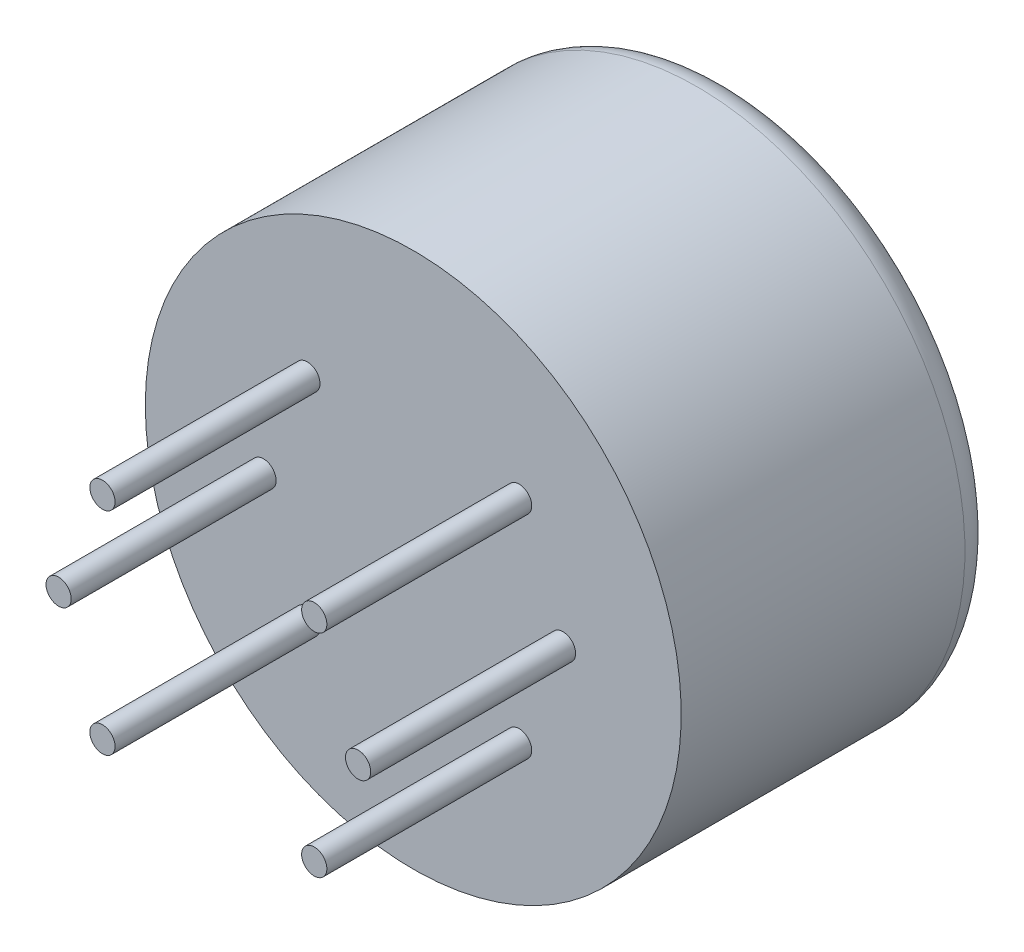
ISO-10303-21;
HEADER;
FILE_DESCRIPTION(('STEP AP214'),'2;1');
FILE_NAME('part.step','',(''),(''),'','','');
FILE_SCHEMA(('AUTOMOTIVE_DESIGN { 1 0 10303 214 1 1 1 1 }'));
ENDSEC;
DATA;
#1=APPLICATION_CONTEXT('core data for automotive mechanical design processes');
#2=APPLICATION_PROTOCOL_DEFINITION('international standard','automotive_design',2000,#1);
#3=PRODUCT_CONTEXT('',#1,'mechanical');
#4=PRODUCT('Part','Part','',(#3));
#5=PRODUCT_RELATED_PRODUCT_CATEGORY('part','',(#4));
#6=PRODUCT_DEFINITION_FORMATION('','',#4);
#7=PRODUCT_DEFINITION_CONTEXT('part definition',#1,'design');
#8=PRODUCT_DEFINITION('design','',#6,#7);
#9=PRODUCT_DEFINITION_SHAPE('','',#8);
#10=(LENGTH_UNIT() NAMED_UNIT(*) SI_UNIT(.MILLI.,.METRE.));
#11=(NAMED_UNIT(*) PLANE_ANGLE_UNIT() SI_UNIT($,.RADIAN.));
#12=(NAMED_UNIT(*) SI_UNIT($,.STERADIAN.) SOLID_ANGLE_UNIT());
#13=UNCERTAINTY_MEASURE_WITH_UNIT(LENGTH_MEASURE(1.E-05),#10,'distance_accuracy_value','');
#14=(GEOMETRIC_REPRESENTATION_CONTEXT(3) GLOBAL_UNCERTAINTY_ASSIGNED_CONTEXT((#13)) GLOBAL_UNIT_ASSIGNED_CONTEXT((#10,
#11,#12)) REPRESENTATION_CONTEXT('',''));
#15=CARTESIAN_POINT('',(0.,0.,0.));
#16=DIRECTION('',(0.,0.,1.));
#17=DIRECTION('',(1.,0.,0.));
#18=AXIS2_PLACEMENT_3D('',#15,#16,#17);
#19=CARTESIAN_POINT('',(0.,0.,-8.));
#20=DIRECTION('',(0.,0.,1.));
#21=DIRECTION('',(1.,0.,0.));
#22=AXIS2_PLACEMENT_3D('',#19,#20,#21);
#23=PLANE('',#22);
#24=CARTESIAN_POINT('',(0.,0.,-8.));
#25=DIRECTION('',(0.,0.,-1.));
#26=DIRECTION('',(-1.,0.,0.));
#27=AXIS2_PLACEMENT_3D('',#24,#25,#26);
#28=CIRCLE('',#27,3.95);
#29=CARTESIAN_POINT('',(-3.95,0.,-8.));
#30=VERTEX_POINT('',#29);
#31=EDGE_CURVE('E98',#30,#30,#28,.T.);
#32=ORIENTED_EDGE('',*,*,#31,.T.);
#33=EDGE_LOOP('',(#32));
#34=FACE_BOUND('',#33,.T.);
#35=ADVANCED_FACE('F43',(#34),#23,.F.);
#36=CARTESIAN_POINT('',(0.,0.,0.));
#37=DIRECTION('',(0.,0.,-1.));
#38=DIRECTION('',(-1.,0.,0.));
#39=AXIS2_PLACEMENT_3D('',#36,#37,#38);
#40=PLANE('',#39);
#41=CARTESIAN_POINT('',(-3.35875721063614,-3.35875721063606,0.));
#42=DIRECTION('',(0.,0.,-1.));
#43=DIRECTION('',(-1.,0.,0.));
#44=AXIS2_PLACEMENT_3D('',#41,#42,#43);
#45=CIRCLE('',#44,0.400000000000001);
#46=CARTESIAN_POINT('',(-3.75875721063614,-3.35875721063606,0.));
#47=VERTEX_POINT('',#46);
#48=EDGE_CURVE('E10',#47,#47,#45,.F.);
#49=ORIENTED_EDGE('',*,*,#48,.F.);
#50=EDGE_LOOP('',(#49));
#51=FACE_BOUND('',#50,.T.);
#52=CARTESIAN_POINT('',(3.35875721063607,-3.35875721063613,0.));
#53=DIRECTION('',(0.,0.,-1.));
#54=DIRECTION('',(-1.,0.,0.));
#55=AXIS2_PLACEMENT_3D('',#52,#53,#54);
#56=CIRCLE('',#55,0.4);
#57=CARTESIAN_POINT('',(2.95875721063607,-3.35875721063613,0.));
#58=VERTEX_POINT('',#57);
#59=EDGE_CURVE('E50',#58,#58,#56,.F.);
#60=ORIENTED_EDGE('',*,*,#59,.F.);
#61=EDGE_LOOP('',(#60));
#62=FACE_BOUND('',#61,.T.);
#63=CARTESIAN_POINT('',(4.75,0.,0.));
#64=DIRECTION('',(0.,0.,-1.));
#65=DIRECTION('',(-1.,0.,0.));
#66=AXIS2_PLACEMENT_3D('',#63,#64,#65);
#67=CIRCLE('',#66,0.4);
#68=CARTESIAN_POINT('',(4.35,0.,0.));
#69=VERTEX_POINT('',#68);
#70=EDGE_CURVE('E55',#69,#69,#67,.F.);
#71=ORIENTED_EDGE('',*,*,#70,.F.);
#72=EDGE_LOOP('',(#71));
#73=FACE_BOUND('',#72,.T.);
#74=CARTESIAN_POINT('',(3.35875721063612,3.35875721063608,0.));
#75=DIRECTION('',(0.,0.,-1.));
#76=DIRECTION('',(-1.,0.,0.));
#77=AXIS2_PLACEMENT_3D('',#74,#75,#76);
#78=CIRCLE('',#77,0.4);
#79=CARTESIAN_POINT('',(2.95875721063612,3.35875721063608,0.));
#80=VERTEX_POINT('',#79);
#81=EDGE_CURVE('E60',#80,#80,#78,.F.);
#82=ORIENTED_EDGE('',*,*,#81,.F.);
#83=EDGE_LOOP('',(#82));
#84=FACE_BOUND('',#83,.T.);
#85=CARTESIAN_POINT('',(-3.35875721063609,3.35875721063611,0.));
#86=DIRECTION('',(0.,0.,-1.));
#87=DIRECTION('',(-1.,0.,0.));
#88=AXIS2_PLACEMENT_3D('',#85,#86,#87);
#89=CIRCLE('',#88,0.4);
#90=CARTESIAN_POINT('',(-3.75875721063609,3.35875721063611,0.));
#91=VERTEX_POINT('',#90);
#92=EDGE_CURVE('E66',#91,#91,#89,.F.);
#93=ORIENTED_EDGE('',*,*,#92,.F.);
#94=EDGE_LOOP('',(#93));
#95=FACE_BOUND('',#94,.T.);
#96=CARTESIAN_POINT('',(-4.75,0.,0.));
#97=DIRECTION('',(0.,0.,-1.));
#98=DIRECTION('',(-1.,0.,0.));
#99=AXIS2_PLACEMENT_3D('',#96,#97,#98);
#100=CIRCLE('',#99,0.4);
#101=CARTESIAN_POINT('',(-5.15,0.,0.));
#102=VERTEX_POINT('',#101);
#103=EDGE_CURVE('E70',#102,#102,#100,.F.);
#104=ORIENTED_EDGE('',*,*,#103,.F.);
#105=EDGE_LOOP('',(#104));
#106=FACE_BOUND('',#105,.T.);
#107=CARTESIAN_POINT('',(0.,0.,0.));
#108=DIRECTION('',(0.,0.,-1.));
#109=DIRECTION('',(-1.,0.,0.));
#110=AXIS2_PLACEMENT_3D('',#107,#108,#109);
#111=CIRCLE('',#110,8.5);
#112=CARTESIAN_POINT('',(-8.5,0.,0.));
#113=VERTEX_POINT('',#112);
#114=EDGE_CURVE('E74',#113,#113,#111,.T.);
#115=ORIENTED_EDGE('',*,*,#114,.F.);
#116=EDGE_LOOP('',(#115));
#117=FACE_BOUND('',#116,.T.);
#118=ADVANCED_FACE('F142',(#51,#62,#73,#84,#95,#106,#117),#40,.F.);
#119=CARTESIAN_POINT('',(0.,0.,-9.83171526777697));
#120=DIRECTION('',(0.,0.,-1.));
#121=DIRECTION('',(-1.,0.,0.));
#122=AXIS2_PLACEMENT_3D('',#119,#120,#121);
#123=CYLINDRICAL_SURFACE('',#122,8.5);
#124=CARTESIAN_POINT('',(0.,0.,-8.99999999999999));
#125=DIRECTION('',(0.,0.,-1.));
#126=DIRECTION('',(-1.,0.,0.));
#127=AXIS2_PLACEMENT_3D('',#124,#125,#126);
#128=CIRCLE('',#127,8.5);
#129=CARTESIAN_POINT('',(-8.5,0.,-8.99999999999999));
#130=VERTEX_POINT('',#129);
#131=EDGE_CURVE('E78',#130,#130,#128,.T.);
#132=ORIENTED_EDGE('',*,*,#131,.F.);
#133=EDGE_LOOP('',(#132));
#134=FACE_BOUND('',#133,.T.);
#135=ORIENTED_EDGE('',*,*,#114,.T.);
#136=EDGE_LOOP('',(#135));
#137=FACE_BOUND('',#136,.T.);
#138=ADVANCED_FACE('F147',(#134,#137),#123,.T.);
#139=CARTESIAN_POINT('',(0.,0.,-9.));
#140=DIRECTION('',(0.,0.,-1.));
#141=DIRECTION('',(-1.,0.,0.));
#142=AXIS2_PLACEMENT_3D('',#139,#140,#141);
#143=TOROIDAL_SURFACE('',#142,7.5,1.);
#144=CARTESIAN_POINT('',(0.,0.,-10.));
#145=DIRECTION('',(0.,0.,-1.));
#146=DIRECTION('',(-1.,0.,0.));
#147=AXIS2_PLACEMENT_3D('',#144,#145,#146);
#148=CIRCLE('',#147,7.5);
#149=CARTESIAN_POINT('',(-7.5,0.,-10.));
#150=VERTEX_POINT('',#149);
#151=EDGE_CURVE('E82',#150,#150,#148,.T.);
#152=ORIENTED_EDGE('',*,*,#151,.F.);
#153=EDGE_LOOP('',(#152));
#154=FACE_BOUND('',#153,.T.);
#155=ORIENTED_EDGE('',*,*,#131,.T.);
#156=EDGE_LOOP('',(#155));
#157=FACE_BOUND('',#156,.T.);
#158=ADVANCED_FACE('F173',(#154,#157),#143,.T.);
#159=CARTESIAN_POINT('',(0.,0.,-10.));
#160=DIRECTION('',(0.,0.,1.));
#161=DIRECTION('',(1.,0.,0.));
#162=AXIS2_PLACEMENT_3D('',#159,#160,#161);
#163=PLANE('',#162);
#164=CARTESIAN_POINT('',(0.,0.,-10.));
#165=DIRECTION('',(0.,0.,-1.));
#166=DIRECTION('',(-1.,0.,0.));
#167=AXIS2_PLACEMENT_3D('',#164,#165,#166);
#168=CIRCLE('',#167,4.55);
#169=CARTESIAN_POINT('',(-4.55,0.,-10.));
#170=VERTEX_POINT('',#169);
#171=EDGE_CURVE('E86',#170,#170,#168,.T.);
#172=ORIENTED_EDGE('',*,*,#171,.F.);
#173=EDGE_LOOP('',(#172));
#174=FACE_BOUND('',#173,.T.);
#175=ORIENTED_EDGE('',*,*,#151,.T.);
#176=EDGE_LOOP('',(#175));
#177=FACE_BOUND('',#176,.T.);
#178=ADVANCED_FACE('F167',(#174,#177),#163,.F.);
#179=CARTESIAN_POINT('',(0.,0.,-9.7));
#180=DIRECTION('',(0.,0.,-1.));
#181=DIRECTION('',(-1.,0.,0.));
#182=AXIS2_PLACEMENT_3D('',#179,#180,#181);
#183=TOROIDAL_SURFACE('',#182,4.55,0.3);
#184=CARTESIAN_POINT('',(0.,0.,-9.7));
#185=DIRECTION('',(0.,0.,-1.));
#186=DIRECTION('',(-1.,0.,0.));
#187=AXIS2_PLACEMENT_3D('',#184,#185,#186);
#188=CIRCLE('',#187,4.25);
#189=CARTESIAN_POINT('',(-4.25,0.,-9.7));
#190=VERTEX_POINT('',#189);
#191=EDGE_CURVE('E90',#190,#190,#188,.T.);
#192=ORIENTED_EDGE('',*,*,#191,.F.);
#193=EDGE_LOOP('',(#192));
#194=FACE_BOUND('',#193,.T.);
#195=ORIENTED_EDGE('',*,*,#171,.T.);
#196=EDGE_LOOP('',(#195));
#197=FACE_BOUND('',#196,.T.);
#198=ADVANCED_FACE('F161',(#194,#197),#183,.T.);
#199=CARTESIAN_POINT('',(0.,0.,-9.83171526777697));
#200=DIRECTION('',(0.,0.,-1.));
#201=DIRECTION('',(-1.,0.,0.));
#202=AXIS2_PLACEMENT_3D('',#199,#200,#201);
#203=CYLINDRICAL_SURFACE('',#202,4.25);
#204=CARTESIAN_POINT('',(0.,0.,-8.3));
#205=DIRECTION('',(0.,0.,-1.));
#206=DIRECTION('',(-1.,0.,0.));
#207=AXIS2_PLACEMENT_3D('',#204,#205,#206);
#208=CIRCLE('',#207,4.25);
#209=CARTESIAN_POINT('',(-4.25,0.,-8.3));
#210=VERTEX_POINT('',#209);
#211=EDGE_CURVE('E94',#210,#210,#208,.T.);
#212=ORIENTED_EDGE('',*,*,#211,.F.);
#213=EDGE_LOOP('',(#212));
#214=FACE_BOUND('',#213,.T.);
#215=ORIENTED_EDGE('',*,*,#191,.T.);
#216=EDGE_LOOP('',(#215));
#217=FACE_BOUND('',#216,.T.);
#218=ADVANCED_FACE('F155',(#214,#217),#203,.F.);
#219=CARTESIAN_POINT('',(0.,0.,-8.3));
#220=DIRECTION('',(0.,0.,-1.));
#221=DIRECTION('',(-1.,0.,0.));
#222=AXIS2_PLACEMENT_3D('',#219,#220,#221);
#223=TOROIDAL_SURFACE('',#222,3.95,0.3);
#224=ORIENTED_EDGE('',*,*,#31,.F.);
#225=EDGE_LOOP('',(#224));
#226=FACE_BOUND('',#225,.T.);
#227=ORIENTED_EDGE('',*,*,#211,.T.);
#228=EDGE_LOOP('',(#227));
#229=FACE_BOUND('',#228,.T.);
#230=ADVANCED_FACE('F151',(#226,#229),#223,.F.);
#231=CARTESIAN_POINT('',(-4.75,0.,6.5));
#232=DIRECTION('',(0.,0.,-1.));
#233=DIRECTION('',(-1.,0.,0.));
#234=AXIS2_PLACEMENT_3D('',#231,#232,#233);
#235=CYLINDRICAL_SURFACE('',#234,0.4);
#236=CARTESIAN_POINT('',(-4.75,0.,6.5));
#237=DIRECTION('',(0.,0.,1.));
#238=DIRECTION('',(1.,0.,0.));
#239=AXIS2_PLACEMENT_3D('',#236,#237,#238);
#240=CIRCLE('',#239,0.4);
#241=CARTESIAN_POINT('',(-4.35,0.,6.5));
#242=VERTEX_POINT('',#241);
#243=EDGE_CURVE('E102',#242,#242,#240,.T.);
#244=ORIENTED_EDGE('',*,*,#243,.F.);
#245=EDGE_LOOP('',(#244));
#246=FACE_BOUND('',#245,.T.);
#247=ORIENTED_EDGE('',*,*,#103,.T.);
#248=EDGE_LOOP('',(#247));
#249=FACE_BOUND('',#248,.T.);
#250=ADVANCED_FACE('F154',(#246,#249),#235,.T.);
#251=CARTESIAN_POINT('',(-4.75,0.,6.5));
#252=DIRECTION('',(0.,0.,1.));
#253=DIRECTION('',(1.,0.,0.));
#254=AXIS2_PLACEMENT_3D('',#251,#252,#253);
#255=PLANE('',#254);
#256=ORIENTED_EDGE('',*,*,#243,.T.);
#257=EDGE_LOOP('',(#256));
#258=FACE_BOUND('',#257,.T.);
#259=ADVANCED_FACE('F192',(#258),#255,.T.);
#260=CARTESIAN_POINT('',(-3.35875721063609,3.35875721063611,6.5));
#261=DIRECTION('',(0.,0.,-1.));
#262=DIRECTION('',(-1.,0.,0.));
#263=AXIS2_PLACEMENT_3D('',#260,#261,#262);
#264=CYLINDRICAL_SURFACE('',#263,0.4);
#265=CARTESIAN_POINT('',(-3.35875721063609,3.35875721063611,6.5));
#266=DIRECTION('',(0.,0.,1.));
#267=DIRECTION('',(1.,0.,0.));
#268=AXIS2_PLACEMENT_3D('',#265,#266,#267);
#269=CIRCLE('',#268,0.4);
#270=CARTESIAN_POINT('',(-2.95875721063609,3.35875721063611,6.5));
#271=VERTEX_POINT('',#270);
#272=EDGE_CURVE('E106',#271,#271,#269,.T.);
#273=ORIENTED_EDGE('',*,*,#272,.F.);
#274=EDGE_LOOP('',(#273));
#275=FACE_BOUND('',#274,.T.);
#276=ORIENTED_EDGE('',*,*,#92,.T.);
#277=EDGE_LOOP('',(#276));
#278=FACE_BOUND('',#277,.T.);
#279=ADVANCED_FACE('F196',(#275,#278),#264,.T.);
#280=CARTESIAN_POINT('',(-3.35875721063609,3.35875721063611,6.5));
#281=DIRECTION('',(0.,0.,1.));
#282=DIRECTION('',(1.,0.,0.));
#283=AXIS2_PLACEMENT_3D('',#280,#281,#282);
#284=PLANE('',#283);
#285=ORIENTED_EDGE('',*,*,#272,.T.);
#286=EDGE_LOOP('',(#285));
#287=FACE_BOUND('',#286,.T.);
#288=ADVANCED_FACE('F200',(#287),#284,.T.);
#289=CARTESIAN_POINT('',(3.35875721063612,3.35875721063608,6.5));
#290=DIRECTION('',(0.,0.,-1.));
#291=DIRECTION('',(-1.,0.,0.));
#292=AXIS2_PLACEMENT_3D('',#289,#290,#291);
#293=CYLINDRICAL_SURFACE('',#292,0.4);
#294=CARTESIAN_POINT('',(3.35875721063612,3.35875721063608,6.5));
#295=DIRECTION('',(0.,0.,1.));
#296=DIRECTION('',(1.,0.,0.));
#297=AXIS2_PLACEMENT_3D('',#294,#295,#296);
#298=CIRCLE('',#297,0.4);
#299=CARTESIAN_POINT('',(3.75875721063612,3.35875721063608,6.5));
#300=VERTEX_POINT('',#299);
#301=EDGE_CURVE('E110',#300,#300,#298,.T.);
#302=ORIENTED_EDGE('',*,*,#301,.F.);
#303=EDGE_LOOP('',(#302));
#304=FACE_BOUND('',#303,.T.);
#305=ORIENTED_EDGE('',*,*,#81,.T.);
#306=EDGE_LOOP('',(#305));
#307=FACE_BOUND('',#306,.T.);
#308=ADVANCED_FACE('F204',(#304,#307),#293,.T.);
#309=CARTESIAN_POINT('',(3.35875721063612,3.35875721063608,6.5));
#310=DIRECTION('',(0.,0.,1.));
#311=DIRECTION('',(1.,0.,0.));
#312=AXIS2_PLACEMENT_3D('',#309,#310,#311);
#313=PLANE('',#312);
#314=ORIENTED_EDGE('',*,*,#301,.T.);
#315=EDGE_LOOP('',(#314));
#316=FACE_BOUND('',#315,.T.);
#317=ADVANCED_FACE('F208',(#316),#313,.T.);
#318=CARTESIAN_POINT('',(4.75,0.,6.5));
#319=DIRECTION('',(0.,0.,-1.));
#320=DIRECTION('',(-1.,0.,0.));
#321=AXIS2_PLACEMENT_3D('',#318,#319,#320);
#322=CYLINDRICAL_SURFACE('',#321,0.4);
#323=CARTESIAN_POINT('',(4.75,0.,6.5));
#324=DIRECTION('',(0.,0.,1.));
#325=DIRECTION('',(1.,0.,0.));
#326=AXIS2_PLACEMENT_3D('',#323,#324,#325);
#327=CIRCLE('',#326,0.4);
#328=CARTESIAN_POINT('',(5.15,0.,6.5));
#329=VERTEX_POINT('',#328);
#330=EDGE_CURVE('E114',#329,#329,#327,.T.);
#331=ORIENTED_EDGE('',*,*,#330,.F.);
#332=EDGE_LOOP('',(#331));
#333=FACE_BOUND('',#332,.T.);
#334=ORIENTED_EDGE('',*,*,#70,.T.);
#335=EDGE_LOOP('',(#334));
#336=FACE_BOUND('',#335,.T.);
#337=ADVANCED_FACE('F212',(#333,#336),#322,.T.);
#338=CARTESIAN_POINT('',(4.75,0.,6.5));
#339=DIRECTION('',(0.,0.,1.));
#340=DIRECTION('',(1.,0.,0.));
#341=AXIS2_PLACEMENT_3D('',#338,#339,#340);
#342=PLANE('',#341);
#343=ORIENTED_EDGE('',*,*,#330,.T.);
#344=EDGE_LOOP('',(#343));
#345=FACE_BOUND('',#344,.T.);
#346=ADVANCED_FACE('F216',(#345),#342,.T.);
#347=CARTESIAN_POINT('',(3.35875721063607,-3.35875721063613,6.5));
#348=DIRECTION('',(0.,0.,-1.));
#349=DIRECTION('',(-1.,0.,0.));
#350=AXIS2_PLACEMENT_3D('',#347,#348,#349);
#351=CYLINDRICAL_SURFACE('',#350,0.4);
#352=CARTESIAN_POINT('',(3.35875721063607,-3.35875721063613,6.5));
#353=DIRECTION('',(0.,0.,1.));
#354=DIRECTION('',(1.,0.,0.));
#355=AXIS2_PLACEMENT_3D('',#352,#353,#354);
#356=CIRCLE('',#355,0.4);
#357=CARTESIAN_POINT('',(3.75875721063607,-3.35875721063613,6.5));
#358=VERTEX_POINT('',#357);
#359=EDGE_CURVE('E118',#358,#358,#356,.T.);
#360=ORIENTED_EDGE('',*,*,#359,.F.);
#361=EDGE_LOOP('',(#360));
#362=FACE_BOUND('',#361,.T.);
#363=ORIENTED_EDGE('',*,*,#59,.T.);
#364=EDGE_LOOP('',(#363));
#365=FACE_BOUND('',#364,.T.);
#366=ADVANCED_FACE('F138',(#362,#365),#351,.T.);
#367=CARTESIAN_POINT('',(3.35875721063607,-3.35875721063613,6.5));
#368=DIRECTION('',(0.,0.,1.));
#369=DIRECTION('',(1.,0.,0.));
#370=AXIS2_PLACEMENT_3D('',#367,#368,#369);
#371=PLANE('',#370);
#372=ORIENTED_EDGE('',*,*,#359,.T.);
#373=EDGE_LOOP('',(#372));
#374=FACE_BOUND('',#373,.T.);
#375=ADVANCED_FACE('F131',(#374),#371,.T.);
#376=CARTESIAN_POINT('',(-3.35875721063614,-3.35875721063606,6.5));
#377=DIRECTION('',(0.,0.,-1.));
#378=DIRECTION('',(-1.,0.,0.));
#379=AXIS2_PLACEMENT_3D('',#376,#377,#378);
#380=CYLINDRICAL_SURFACE('',#379,0.400000000000001);
#381=CARTESIAN_POINT('',(-3.35875721063614,-3.35875721063606,6.5));
#382=DIRECTION('',(0.,0.,1.));
#383=DIRECTION('',(1.,0.,0.));
#384=AXIS2_PLACEMENT_3D('',#381,#382,#383);
#385=CIRCLE('',#384,0.400000000000001);
#386=CARTESIAN_POINT('',(-2.95875721063614,-3.35875721063606,6.5));
#387=VERTEX_POINT('',#386);
#388=EDGE_CURVE('E122',#387,#387,#385,.T.);
#389=ORIENTED_EDGE('',*,*,#388,.F.);
#390=EDGE_LOOP('',(#389));
#391=FACE_BOUND('',#390,.T.);
#392=ORIENTED_EDGE('',*,*,#48,.T.);
#393=EDGE_LOOP('',(#392));
#394=FACE_BOUND('',#393,.T.);
#395=ADVANCED_FACE('F129',(#391,#394),#380,.T.);
#396=CARTESIAN_POINT('',(-3.35875721063614,-3.35875721063606,6.5));
#397=DIRECTION('',(0.,0.,1.));
#398=DIRECTION('',(1.,0.,0.));
#399=AXIS2_PLACEMENT_3D('',#396,#397,#398);
#400=PLANE('',#399);
#401=ORIENTED_EDGE('',*,*,#388,.T.);
#402=EDGE_LOOP('',(#401));
#403=FACE_BOUND('',#402,.T.);
#404=ADVANCED_FACE('F127',(#403),#400,.T.);
#405=CLOSED_SHELL('',(#35,#118,#138,#158,#178,#198,#218,#230,#250,#259,#279,#288,#308,#317,#337,
#346,#366,#375,#395,#404));
#406=MANIFOLD_SOLID_BREP('B2',#405);
#407=ADVANCED_BREP_SHAPE_REPRESENTATION('',(#18,#406),#14);
#408=SHAPE_DEFINITION_REPRESENTATION(#9,#407);
ENDSEC;
END-ISO-10303-21;
